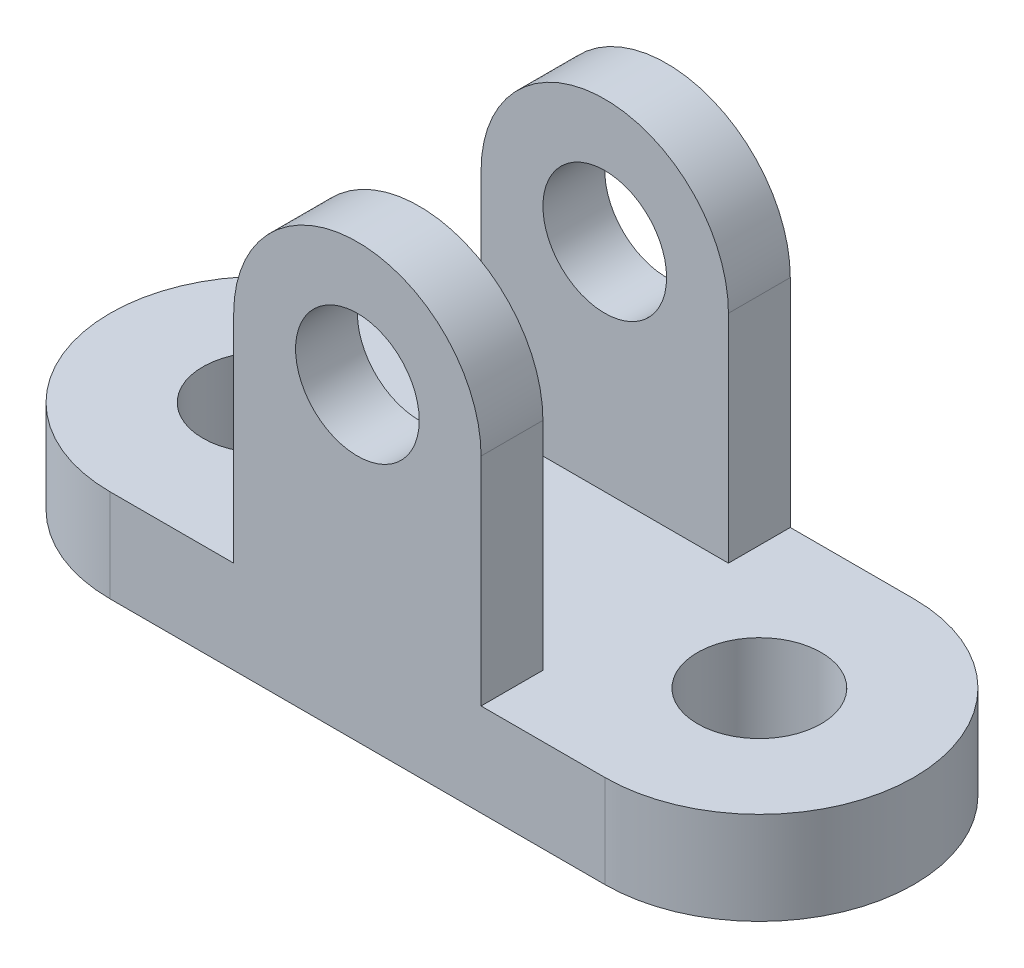
ISO-10303-21;
HEADER;
FILE_DESCRIPTION(('STEP AP214'),'2;1');
FILE_NAME('part.step','',(''),(''),'','','');
FILE_SCHEMA(('AUTOMOTIVE_DESIGN { 1 0 10303 214 1 1 1 1 }'));
ENDSEC;
DATA;
#1=APPLICATION_CONTEXT('core data for automotive mechanical design processes');
#2=APPLICATION_PROTOCOL_DEFINITION('international standard','automotive_design',2000,#1);
#3=PRODUCT_CONTEXT('',#1,'mechanical');
#4=PRODUCT('Part','Part','',(#3));
#5=PRODUCT_RELATED_PRODUCT_CATEGORY('part','',(#4));
#6=PRODUCT_DEFINITION_FORMATION('','',#4);
#7=PRODUCT_DEFINITION_CONTEXT('part definition',#1,'design');
#8=PRODUCT_DEFINITION('design','',#6,#7);
#9=PRODUCT_DEFINITION_SHAPE('','',#8);
#10=(LENGTH_UNIT() NAMED_UNIT(*) SI_UNIT(.MILLI.,.METRE.));
#11=(NAMED_UNIT(*) PLANE_ANGLE_UNIT() SI_UNIT($,.RADIAN.));
#12=(NAMED_UNIT(*) SI_UNIT($,.STERADIAN.) SOLID_ANGLE_UNIT());
#13=UNCERTAINTY_MEASURE_WITH_UNIT(LENGTH_MEASURE(1.E-05),#10,'distance_accuracy_value','');
#14=(GEOMETRIC_REPRESENTATION_CONTEXT(3) GLOBAL_UNCERTAINTY_ASSIGNED_CONTEXT((#13)) GLOBAL_UNIT_ASSIGNED_CONTEXT((#10,
#11,#12)) REPRESENTATION_CONTEXT('',''));
#15=CARTESIAN_POINT('',(0.,0.,0.));
#16=DIRECTION('',(0.,0.,1.));
#17=DIRECTION('',(1.,0.,0.));
#18=AXIS2_PLACEMENT_3D('',#15,#16,#17);
#19=CARTESIAN_POINT('',(0.,50.,-25.));
#20=DIRECTION('',(0.,0.,-1.));
#21=DIRECTION('',(-1.,0.,0.));
#22=AXIS2_PLACEMENT_3D('',#19,#20,#21);
#23=CYLINDRICAL_SURFACE('',#22,20.);
#24=CARTESIAN_POINT('',(0.,50.,15.));
#25=DIRECTION('',(0.,0.,-1.));
#26=DIRECTION('',(-1.,0.,0.));
#27=AXIS2_PLACEMENT_3D('',#24,#25,#26);
#28=CIRCLE('',#27,20.);
#29=CARTESIAN_POINT('',(20.,50.,15.));
#30=VERTEX_POINT('',#29);
#31=CARTESIAN_POINT('',(-20.,50.,15.));
#32=VERTEX_POINT('',#31);
#33=EDGE_CURVE('E136',#30,#32,#28,.F.);
#34=ORIENTED_EDGE('',*,*,#33,.T.);
#35=DIRECTION('',(0.,0.,-1.));
#36=VECTOR('',#35,1.);
#37=CARTESIAN_POINT('',(-20.,50.,25.));
#38=LINE('',#37,#36);
#39=CARTESIAN_POINT('',(-20.,50.,25.));
#40=VERTEX_POINT('',#39);
#41=EDGE_CURVE('E198',#40,#32,#38,.T.);
#42=ORIENTED_EDGE('',*,*,#41,.F.);
#43=CARTESIAN_POINT('',(0.,50.,25.));
#44=DIRECTION('',(0.,0.,-1.));
#45=DIRECTION('',(-1.,0.,0.));
#46=AXIS2_PLACEMENT_3D('',#43,#44,#45);
#47=CIRCLE('',#46,20.);
#48=CARTESIAN_POINT('',(20.,50.,25.));
#49=VERTEX_POINT('',#48);
#50=EDGE_CURVE('E62',#49,#40,#47,.F.);
#51=ORIENTED_EDGE('',*,*,#50,.F.);
#52=DIRECTION('',(0.,0.,-1.));
#53=VECTOR('',#52,1.);
#54=CARTESIAN_POINT('',(20.,50.,25.));
#55=LINE('',#54,#53);
#56=EDGE_CURVE('E191',#30,#49,#55,.F.);
#57=ORIENTED_EDGE('',*,*,#56,.F.);
#58=EDGE_LOOP('',(#34,#42,#51,#57));
#59=FACE_BOUND('',#58,.T.);
#60=ADVANCED_FACE('F41',(#59),#23,.T.);
#61=CARTESIAN_POINT('',(0.,50.,-15.));
#62=DIRECTION('',(0.,0.,1.));
#63=DIRECTION('',(1.,0.,0.));
#64=AXIS2_PLACEMENT_3D('',#61,#62,#63);
#65=CIRCLE('',#64,20.);
#66=CARTESIAN_POINT('',(-20.,50.,-15.));
#67=VERTEX_POINT('',#66);
#68=CARTESIAN_POINT('',(20.,50.,-15.));
#69=VERTEX_POINT('',#68);
#70=EDGE_CURVE('E131',#67,#69,#65,.F.);
#71=ORIENTED_EDGE('',*,*,#70,.T.);
#72=CARTESIAN_POINT('',(20.,50.,-25.));
#73=VERTEX_POINT('',#72);
#74=EDGE_CURVE('E195',#73,#69,#55,.F.);
#75=ORIENTED_EDGE('',*,*,#74,.F.);
#76=CARTESIAN_POINT('',(0.,50.,-25.));
#77=DIRECTION('',(0.,0.,1.));
#78=DIRECTION('',(1.,0.,0.));
#79=AXIS2_PLACEMENT_3D('',#76,#77,#78);
#80=CIRCLE('',#79,20.);
#81=CARTESIAN_POINT('',(-20.,50.,-25.));
#82=VERTEX_POINT('',#81);
#83=EDGE_CURVE('E200',#82,#73,#80,.F.);
#84=ORIENTED_EDGE('',*,*,#83,.F.);
#85=EDGE_CURVE('E194',#67,#82,#38,.T.);
#86=ORIENTED_EDGE('',*,*,#85,.F.);
#87=EDGE_LOOP('',(#71,#75,#84,#86));
#88=FACE_BOUND('',#87,.T.);
#89=ADVANCED_FACE('F209',(#88),#23,.T.);
#90=CARTESIAN_POINT('',(-20.,70.,25.));
#91=DIRECTION('',(1.,0.,0.));
#92=DIRECTION('',(0.,1.,0.));
#93=AXIS2_PLACEMENT_3D('',#90,#91,#92);
#94=PLANE('',#93);
#95=DIRECTION('',(0.,1.,0.));
#96=VECTOR('',#95,1.);
#97=CARTESIAN_POINT('',(-20.,70.,15.));
#98=LINE('',#97,#96);
#99=CARTESIAN_POINT('',(-20.,15.,15.));
#100=VERTEX_POINT('',#99);
#101=EDGE_CURVE('E214',#100,#32,#98,.T.);
#102=ORIENTED_EDGE('',*,*,#101,.F.);
#103=DIRECTION('',(0.,0.,-1.));
#104=VECTOR('',#103,1.);
#105=CARTESIAN_POINT('',(-20.,15.,25.));
#106=LINE('',#105,#104);
#107=CARTESIAN_POINT('',(-20.,15.,25.));
#108=VERTEX_POINT('',#107);
#109=EDGE_CURVE('E151',#108,#100,#106,.T.);
#110=ORIENTED_EDGE('',*,*,#109,.F.);
#111=DIRECTION('',(0.,-1.,0.));
#112=VECTOR('',#111,1.);
#113=CARTESIAN_POINT('',(-20.,70.,25.));
#114=LINE('',#113,#112);
#115=EDGE_CURVE('E217',#40,#108,#114,.T.);
#116=ORIENTED_EDGE('',*,*,#115,.F.);
#117=ORIENTED_EDGE('',*,*,#41,.T.);
#118=EDGE_LOOP('',(#102,#110,#116,#117));
#119=FACE_BOUND('',#118,.T.);
#120=ADVANCED_FACE('F248',(#119),#94,.F.);
#121=DIRECTION('',(0.,-1.,0.));
#122=VECTOR('',#121,1.);
#123=CARTESIAN_POINT('',(-20.,70.,-15.));
#124=LINE('',#123,#122);
#125=CARTESIAN_POINT('',(-20.,15.,-15.));
#126=VERTEX_POINT('',#125);
#127=EDGE_CURVE('E128',#67,#126,#124,.T.);
#128=ORIENTED_EDGE('',*,*,#127,.F.);
#129=ORIENTED_EDGE('',*,*,#85,.T.);
#130=DIRECTION('',(0.,-1.,0.));
#131=VECTOR('',#130,1.);
#132=CARTESIAN_POINT('',(-20.,70.,-25.));
#133=LINE('',#132,#131);
#134=CARTESIAN_POINT('',(-20.,15.,-25.));
#135=VERTEX_POINT('',#134);
#136=EDGE_CURVE('E149',#82,#135,#133,.T.);
#137=ORIENTED_EDGE('',*,*,#136,.T.);
#138=EDGE_CURVE('E143',#126,#135,#106,.T.);
#139=ORIENTED_EDGE('',*,*,#138,.F.);
#140=EDGE_LOOP('',(#128,#129,#137,#139));
#141=FACE_BOUND('',#140,.T.);
#142=ADVANCED_FACE('F150',(#141),#94,.F.);
#143=CARTESIAN_POINT('',(20.,70.,25.));
#144=DIRECTION('',(-1.,0.,0.));
#145=DIRECTION('',(0.,-1.,0.));
#146=AXIS2_PLACEMENT_3D('',#143,#144,#145);
#147=PLANE('',#146);
#148=DIRECTION('',(0.,-1.,0.));
#149=VECTOR('',#148,1.);
#150=CARTESIAN_POINT('',(20.,70.,15.));
#151=LINE('',#150,#149);
#152=CARTESIAN_POINT('',(20.,15.,15.));
#153=VERTEX_POINT('',#152);
#154=EDGE_CURVE('E11',#30,#153,#151,.T.);
#155=ORIENTED_EDGE('',*,*,#154,.F.);
#156=ORIENTED_EDGE('',*,*,#56,.T.);
#157=DIRECTION('',(0.,1.,0.));
#158=VECTOR('',#157,1.);
#159=CARTESIAN_POINT('',(20.,70.,25.));
#160=LINE('',#159,#158);
#161=CARTESIAN_POINT('',(20.,15.,25.));
#162=VERTEX_POINT('',#161);
#163=EDGE_CURVE('E219',#162,#49,#160,.T.);
#164=ORIENTED_EDGE('',*,*,#163,.F.);
#165=DIRECTION('',(0.,0.,-1.));
#166=VECTOR('',#165,1.);
#167=CARTESIAN_POINT('',(20.,15.,25.));
#168=LINE('',#167,#166);
#169=EDGE_CURVE('E155',#162,#153,#168,.T.);
#170=ORIENTED_EDGE('',*,*,#169,.T.);
#171=EDGE_LOOP('',(#155,#156,#164,#170));
#172=FACE_BOUND('',#171,.T.);
#173=ADVANCED_FACE('F255',(#172),#147,.F.);
#174=DIRECTION('',(0.,1.,0.));
#175=VECTOR('',#174,1.);
#176=CARTESIAN_POINT('',(20.,70.,-15.));
#177=LINE('',#176,#175);
#178=CARTESIAN_POINT('',(20.,15.,-15.));
#179=VERTEX_POINT('',#178);
#180=EDGE_CURVE('E49',#179,#69,#177,.T.);
#181=ORIENTED_EDGE('',*,*,#180,.F.);
#182=CARTESIAN_POINT('',(20.,15.,-25.));
#183=VERTEX_POINT('',#182);
#184=EDGE_CURVE('E145',#179,#183,#168,.T.);
#185=ORIENTED_EDGE('',*,*,#184,.T.);
#186=DIRECTION('',(0.,1.,0.));
#187=VECTOR('',#186,1.);
#188=CARTESIAN_POINT('',(20.,70.,-25.));
#189=LINE('',#188,#187);
#190=EDGE_CURVE('E210',#183,#73,#189,.T.);
#191=ORIENTED_EDGE('',*,*,#190,.T.);
#192=ORIENTED_EDGE('',*,*,#74,.T.);
#193=EDGE_LOOP('',(#181,#185,#191,#192));
#194=FACE_BOUND('',#193,.T.);
#195=ADVANCED_FACE('F202',(#194),#147,.F.);
#196=CARTESIAN_POINT('',(-40.,15.,0.));
#197=DIRECTION('',(0.,-1.,0.));
#198=DIRECTION('',(0.,0.,-1.));
#199=AXIS2_PLACEMENT_3D('',#196,#197,#198);
#200=CYLINDRICAL_SURFACE('',#199,25.);
#201=CARTESIAN_POINT('',(-40.,0.,0.));
#202=DIRECTION('',(0.,1.,0.));
#203=DIRECTION('',(0.,0.,1.));
#204=AXIS2_PLACEMENT_3D('',#201,#202,#203);
#205=CIRCLE('',#204,25.);
#206=CARTESIAN_POINT('',(-40.,0.,-25.));
#207=VERTEX_POINT('',#206);
#208=CARTESIAN_POINT('',(-40.,0.,25.));
#209=VERTEX_POINT('',#208);
#210=EDGE_CURVE('E154',#207,#209,#205,.T.);
#211=ORIENTED_EDGE('',*,*,#210,.T.);
#212=DIRECTION('',(0.,-1.,0.));
#213=VECTOR('',#212,1.);
#214=CARTESIAN_POINT('',(-40.,15.,25.));
#215=LINE('',#214,#213);
#216=CARTESIAN_POINT('',(-40.,15.,25.));
#217=VERTEX_POINT('',#216);
#218=EDGE_CURVE('E190',#217,#209,#215,.T.);
#219=ORIENTED_EDGE('',*,*,#218,.F.);
#220=CARTESIAN_POINT('',(-40.,15.,0.));
#221=DIRECTION('',(0.,1.,0.));
#222=DIRECTION('',(0.,0.,1.));
#223=AXIS2_PLACEMENT_3D('',#220,#221,#222);
#224=CIRCLE('',#223,25.);
#225=CARTESIAN_POINT('',(-40.,15.,-25.));
#226=VERTEX_POINT('',#225);
#227=EDGE_CURVE('E159',#226,#217,#224,.T.);
#228=ORIENTED_EDGE('',*,*,#227,.F.);
#229=DIRECTION('',(0.,-1.,0.));
#230=VECTOR('',#229,1.);
#231=CARTESIAN_POINT('',(-40.,15.,-25.));
#232=LINE('',#231,#230);
#233=EDGE_CURVE('E171',#226,#207,#232,.T.);
#234=ORIENTED_EDGE('',*,*,#233,.T.);
#235=EDGE_LOOP('',(#211,#219,#228,#234));
#236=FACE_BOUND('',#235,.T.);
#237=ADVANCED_FACE('F238',(#236),#200,.T.);
#238=CARTESIAN_POINT('',(-40.,15.,25.));
#239=DIRECTION('',(0.,0.,-1.));
#240=DIRECTION('',(-1.,0.,0.));
#241=AXIS2_PLACEMENT_3D('',#238,#239,#240);
#242=PLANE('',#241);
#243=CARTESIAN_POINT('',(0.,50.,25.));
#244=DIRECTION('',(0.,0.,1.));
#245=DIRECTION('',(1.,0.,0.));
#246=AXIS2_PLACEMENT_3D('',#243,#244,#245);
#247=CIRCLE('',#246,9.99999999999999);
#248=CARTESIAN_POINT('',(9.99999999999998,50.,25.));
#249=VERTEX_POINT('',#248);
#250=EDGE_CURVE('E370',#249,#249,#247,.T.);
#251=ORIENTED_EDGE('',*,*,#250,.F.);
#252=EDGE_LOOP('',(#251));
#253=FACE_BOUND('',#252,.T.);
#254=ORIENTED_EDGE('',*,*,#163,.T.);
#255=ORIENTED_EDGE('',*,*,#50,.T.);
#256=ORIENTED_EDGE('',*,*,#115,.T.);
#257=DIRECTION('',(1.,0.,0.));
#258=VECTOR('',#257,1.);
#259=CARTESIAN_POINT('',(-40.,15.,25.));
#260=LINE('',#259,#258);
#261=EDGE_CURVE('E163',#217,#108,#260,.T.);
#262=ORIENTED_EDGE('',*,*,#261,.F.);
#263=ORIENTED_EDGE('',*,*,#218,.T.);
#264=DIRECTION('',(1.,0.,0.));
#265=VECTOR('',#264,1.);
#266=CARTESIAN_POINT('',(-40.,0.,25.));
#267=LINE('',#266,#265);
#268=CARTESIAN_POINT('',(40.,0.,25.));
#269=VERTEX_POINT('',#268);
#270=EDGE_CURVE('E172',#209,#269,#267,.T.);
#271=ORIENTED_EDGE('',*,*,#270,.T.);
#272=DIRECTION('',(0.,-1.,0.));
#273=VECTOR('',#272,1.);
#274=CARTESIAN_POINT('',(40.,15.,25.));
#275=LINE('',#274,#273);
#276=CARTESIAN_POINT('',(40.,15.,25.));
#277=VERTEX_POINT('',#276);
#278=EDGE_CURVE('E183',#277,#269,#275,.T.);
#279=ORIENTED_EDGE('',*,*,#278,.F.);
#280=EDGE_CURVE('E165',#162,#277,#260,.T.);
#281=ORIENTED_EDGE('',*,*,#280,.F.);
#282=EDGE_LOOP('',(#254,#255,#256,#262,#263,#271,#279,#281));
#283=FACE_BOUND('',#282,.T.);
#284=ADVANCED_FACE('F245',(#253,#283),#242,.F.);
#285=CARTESIAN_POINT('',(40.,15.,0.));
#286=DIRECTION('',(0.,-1.,0.));
#287=DIRECTION('',(0.,0.,-1.));
#288=AXIS2_PLACEMENT_3D('',#285,#286,#287);
#289=CYLINDRICAL_SURFACE('',#288,25.);
#290=CARTESIAN_POINT('',(40.,0.,0.));
#291=DIRECTION('',(0.,1.,0.));
#292=DIRECTION('',(0.,0.,1.));
#293=AXIS2_PLACEMENT_3D('',#290,#291,#292);
#294=CIRCLE('',#293,25.);
#295=CARTESIAN_POINT('',(40.,0.,-25.));
#296=VERTEX_POINT('',#295);
#297=EDGE_CURVE('E180',#269,#296,#294,.T.);
#298=ORIENTED_EDGE('',*,*,#297,.T.);
#299=DIRECTION('',(0.,-1.,0.));
#300=VECTOR('',#299,1.);
#301=CARTESIAN_POINT('',(40.,15.,-25.));
#302=LINE('',#301,#300);
#303=CARTESIAN_POINT('',(40.,15.,-25.));
#304=VERTEX_POINT('',#303);
#305=EDGE_CURVE('E185',#304,#296,#302,.T.);
#306=ORIENTED_EDGE('',*,*,#305,.F.);
#307=CARTESIAN_POINT('',(40.,15.,0.));
#308=DIRECTION('',(0.,1.,0.));
#309=DIRECTION('',(0.,0.,1.));
#310=AXIS2_PLACEMENT_3D('',#307,#308,#309);
#311=CIRCLE('',#310,25.);
#312=EDGE_CURVE('E170',#277,#304,#311,.T.);
#313=ORIENTED_EDGE('',*,*,#312,.F.);
#314=ORIENTED_EDGE('',*,*,#278,.T.);
#315=EDGE_LOOP('',(#298,#306,#313,#314));
#316=FACE_BOUND('',#315,.T.);
#317=ADVANCED_FACE('F231',(#316),#289,.T.);
#318=CARTESIAN_POINT('',(-40.,15.,-25.));
#319=DIRECTION('',(0.,0.,1.));
#320=DIRECTION('',(1.,0.,0.));
#321=AXIS2_PLACEMENT_3D('',#318,#319,#320);
#322=PLANE('',#321);
#323=CARTESIAN_POINT('',(0.,50.,-25.));
#324=DIRECTION('',(0.,0.,1.));
#325=DIRECTION('',(1.,0.,0.));
#326=AXIS2_PLACEMENT_3D('',#323,#324,#325);
#327=CIRCLE('',#326,9.99999999999999);
#328=CARTESIAN_POINT('',(9.99999999999999,50.,-25.));
#329=VERTEX_POINT('',#328);
#330=EDGE_CURVE('E366',#329,#329,#327,.T.);
#331=ORIENTED_EDGE('',*,*,#330,.T.);
#332=EDGE_LOOP('',(#331));
#333=FACE_BOUND('',#332,.T.);
#334=ORIENTED_EDGE('',*,*,#136,.F.);
#335=ORIENTED_EDGE('',*,*,#83,.T.);
#336=ORIENTED_EDGE('',*,*,#190,.F.);
#337=DIRECTION('',(-1.,0.,0.));
#338=VECTOR('',#337,1.);
#339=CARTESIAN_POINT('',(-40.,15.,-25.));
#340=LINE('',#339,#338);
#341=EDGE_CURVE('E168',#304,#183,#340,.T.);
#342=ORIENTED_EDGE('',*,*,#341,.F.);
#343=ORIENTED_EDGE('',*,*,#305,.T.);
#344=DIRECTION('',(-1.,0.,0.));
#345=VECTOR('',#344,1.);
#346=CARTESIAN_POINT('',(-40.,0.,-25.));
#347=LINE('',#346,#345);
#348=EDGE_CURVE('E162',#296,#207,#347,.T.);
#349=ORIENTED_EDGE('',*,*,#348,.T.);
#350=ORIENTED_EDGE('',*,*,#233,.F.);
#351=EDGE_CURVE('E166',#135,#226,#340,.T.);
#352=ORIENTED_EDGE('',*,*,#351,.F.);
#353=EDGE_LOOP('',(#334,#335,#336,#342,#343,#349,#350,#352));
#354=FACE_BOUND('',#353,.T.);
#355=ADVANCED_FACE('F223',(#333,#354),#322,.F.);
#356=CARTESIAN_POINT('',(-40.,15.,0.));
#357=DIRECTION('',(0.,1.,0.));
#358=DIRECTION('',(0.,0.,1.));
#359=AXIS2_PLACEMENT_3D('',#356,#357,#358);
#360=PLANE('',#359);
#361=CARTESIAN_POINT('',(40.,15.,0.));
#362=DIRECTION('',(0.,1.,0.));
#363=DIRECTION('',(0.,0.,1.));
#364=AXIS2_PLACEMENT_3D('',#361,#362,#363);
#365=CIRCLE('',#364,9.99999999999999);
#366=CARTESIAN_POINT('',(40.,15.,9.99999999999998));
#367=VERTEX_POINT('',#366);
#368=EDGE_CURVE('E372',#367,#367,#365,.T.);
#369=ORIENTED_EDGE('',*,*,#368,.F.);
#370=EDGE_LOOP('',(#369));
#371=FACE_BOUND('',#370,.T.);
#372=CARTESIAN_POINT('',(-40.,15.,0.));
#373=DIRECTION('',(0.,1.,0.));
#374=DIRECTION('',(0.,0.,1.));
#375=AXIS2_PLACEMENT_3D('',#372,#373,#374);
#376=CIRCLE('',#375,10.);
#377=CARTESIAN_POINT('',(-40.,15.,10.));
#378=VERTEX_POINT('',#377);
#379=EDGE_CURVE('E379',#378,#378,#376,.T.);
#380=ORIENTED_EDGE('',*,*,#379,.F.);
#381=EDGE_LOOP('',(#380));
#382=FACE_BOUND('',#381,.T.);
#383=ORIENTED_EDGE('',*,*,#312,.T.);
#384=ORIENTED_EDGE('',*,*,#341,.T.);
#385=ORIENTED_EDGE('',*,*,#184,.F.);
#386=DIRECTION('',(-1.,0.,0.));
#387=VECTOR('',#386,1.);
#388=CARTESIAN_POINT('',(-60.1608300907912,15.,-15.));
#389=LINE('',#388,#387);
#390=EDGE_CURVE('E60',#179,#126,#389,.T.);
#391=ORIENTED_EDGE('',*,*,#390,.T.);
#392=ORIENTED_EDGE('',*,*,#138,.T.);
#393=ORIENTED_EDGE('',*,*,#351,.T.);
#394=ORIENTED_EDGE('',*,*,#227,.T.);
#395=ORIENTED_EDGE('',*,*,#261,.T.);
#396=ORIENTED_EDGE('',*,*,#109,.T.);
#397=DIRECTION('',(1.,0.,0.));
#398=VECTOR('',#397,1.);
#399=CARTESIAN_POINT('',(-60.1608300907912,15.,15.));
#400=LINE('',#399,#398);
#401=EDGE_CURVE('E144',#100,#153,#400,.T.);
#402=ORIENTED_EDGE('',*,*,#401,.T.);
#403=ORIENTED_EDGE('',*,*,#169,.F.);
#404=ORIENTED_EDGE('',*,*,#280,.T.);
#405=EDGE_LOOP('',(#383,#384,#385,#391,#392,#393,#394,#395,#396,#402,#403,#404));
#406=FACE_BOUND('',#405,.T.);
#407=ADVANCED_FACE('F139',(#371,#382,#406),#360,.T.);
#408=CARTESIAN_POINT('',(-40.,0.,0.));
#409=DIRECTION('',(0.,1.,0.));
#410=DIRECTION('',(0.,0.,1.));
#411=AXIS2_PLACEMENT_3D('',#408,#409,#410);
#412=PLANE('',#411);
#413=CARTESIAN_POINT('',(40.,0.,0.));
#414=DIRECTION('',(0.,1.,0.));
#415=DIRECTION('',(0.,0.,1.));
#416=AXIS2_PLACEMENT_3D('',#413,#414,#415);
#417=CIRCLE('',#416,9.99999999999999);
#418=CARTESIAN_POINT('',(40.,0.,9.99999999999998));
#419=VERTEX_POINT('',#418);
#420=EDGE_CURVE('E380',#419,#419,#417,.T.);
#421=ORIENTED_EDGE('',*,*,#420,.T.);
#422=EDGE_LOOP('',(#421));
#423=FACE_BOUND('',#422,.T.);
#424=CARTESIAN_POINT('',(-40.,0.,0.));
#425=DIRECTION('',(0.,1.,0.));
#426=DIRECTION('',(0.,0.,1.));
#427=AXIS2_PLACEMENT_3D('',#424,#425,#426);
#428=CIRCLE('',#427,9.99999999999999);
#429=CARTESIAN_POINT('',(-40.,0.,9.99999999999999));
#430=VERTEX_POINT('',#429);
#431=EDGE_CURVE('E253',#430,#430,#428,.T.);
#432=ORIENTED_EDGE('',*,*,#431,.T.);
#433=EDGE_LOOP('',(#432));
#434=FACE_BOUND('',#433,.T.);
#435=ORIENTED_EDGE('',*,*,#210,.F.);
#436=ORIENTED_EDGE('',*,*,#348,.F.);
#437=ORIENTED_EDGE('',*,*,#297,.F.);
#438=ORIENTED_EDGE('',*,*,#270,.F.);
#439=EDGE_LOOP('',(#435,#436,#437,#438));
#440=FACE_BOUND('',#439,.T.);
#441=ADVANCED_FACE('F240',(#423,#434,#440),#412,.F.);
#442=CARTESIAN_POINT('',(-60.1608300907912,70.,15.));
#443=DIRECTION('',(0.,0.,-1.));
#444=DIRECTION('',(-1.,0.,0.));
#445=AXIS2_PLACEMENT_3D('',#442,#443,#444);
#446=PLANE('',#445);
#447=CARTESIAN_POINT('',(0.,50.,15.));
#448=DIRECTION('',(0.,0.,-1.));
#449=DIRECTION('',(-1.,0.,0.));
#450=AXIS2_PLACEMENT_3D('',#447,#448,#449);
#451=CIRCLE('',#450,9.99999999999999);
#452=CARTESIAN_POINT('',(-10.,50.,15.));
#453=VERTEX_POINT('',#452);
#454=EDGE_CURVE('E365',#453,#453,#451,.T.);
#455=ORIENTED_EDGE('',*,*,#454,.F.);
#456=EDGE_LOOP('',(#455));
#457=FACE_BOUND('',#456,.T.);
#458=ORIENTED_EDGE('',*,*,#101,.T.);
#459=ORIENTED_EDGE('',*,*,#33,.F.);
#460=ORIENTED_EDGE('',*,*,#154,.T.);
#461=ORIENTED_EDGE('',*,*,#401,.F.);
#462=EDGE_LOOP('',(#458,#459,#460,#461));
#463=FACE_BOUND('',#462,.T.);
#464=ADVANCED_FACE('F260',(#457,#463),#446,.T.);
#465=CARTESIAN_POINT('',(-60.1608300907912,70.,-15.));
#466=DIRECTION('',(0.,0.,1.));
#467=DIRECTION('',(1.,0.,0.));
#468=AXIS2_PLACEMENT_3D('',#465,#466,#467);
#469=PLANE('',#468);
#470=CARTESIAN_POINT('',(0.,50.,-15.));
#471=DIRECTION('',(0.,0.,1.));
#472=DIRECTION('',(1.,0.,0.));
#473=AXIS2_PLACEMENT_3D('',#470,#471,#472);
#474=CIRCLE('',#473,9.99999999999999);
#475=CARTESIAN_POINT('',(9.99999999999999,50.,-15.));
#476=VERTEX_POINT('',#475);
#477=EDGE_CURVE('E44',#476,#476,#474,.T.);
#478=ORIENTED_EDGE('',*,*,#477,.F.);
#479=EDGE_LOOP('',(#478));
#480=FACE_BOUND('',#479,.T.);
#481=ORIENTED_EDGE('',*,*,#127,.T.);
#482=ORIENTED_EDGE('',*,*,#390,.F.);
#483=ORIENTED_EDGE('',*,*,#180,.T.);
#484=ORIENTED_EDGE('',*,*,#70,.F.);
#485=EDGE_LOOP('',(#481,#482,#483,#484));
#486=FACE_BOUND('',#485,.T.);
#487=ADVANCED_FACE('F134',(#480,#486),#469,.T.);
#488=CARTESIAN_POINT('',(-40.,15.,0.));
#489=DIRECTION('',(0.,1.,0.));
#490=DIRECTION('',(0.,0.,1.));
#491=AXIS2_PLACEMENT_3D('',#488,#489,#490);
#492=CYLINDRICAL_SURFACE('',#491,10.);
#493=ORIENTED_EDGE('',*,*,#431,.F.);
#494=EDGE_LOOP('',(#493));
#495=FACE_BOUND('',#494,.T.);
#496=ORIENTED_EDGE('',*,*,#379,.T.);
#497=EDGE_LOOP('',(#496));
#498=FACE_BOUND('',#497,.T.);
#499=ADVANCED_FACE('F264',(#495,#498),#492,.F.);
#500=CARTESIAN_POINT('',(40.,15.,0.));
#501=DIRECTION('',(0.,1.,0.));
#502=DIRECTION('',(0.,0.,1.));
#503=AXIS2_PLACEMENT_3D('',#500,#501,#502);
#504=CYLINDRICAL_SURFACE('',#503,9.99999999999999);
#505=ORIENTED_EDGE('',*,*,#420,.F.);
#506=EDGE_LOOP('',(#505));
#507=FACE_BOUND('',#506,.T.);
#508=ORIENTED_EDGE('',*,*,#368,.T.);
#509=EDGE_LOOP('',(#508));
#510=FACE_BOUND('',#509,.T.);
#511=ADVANCED_FACE('F329',(#507,#510),#504,.F.);
#512=CARTESIAN_POINT('',(0.,50.,25.));
#513=DIRECTION('',(0.,0.,1.));
#514=DIRECTION('',(1.,0.,0.));
#515=AXIS2_PLACEMENT_3D('',#512,#513,#514);
#516=CYLINDRICAL_SURFACE('',#515,9.99999999999999);
#517=ORIENTED_EDGE('',*,*,#477,.T.);
#518=EDGE_LOOP('',(#517));
#519=FACE_BOUND('',#518,.T.);
#520=ORIENTED_EDGE('',*,*,#330,.F.);
#521=EDGE_LOOP('',(#520));
#522=FACE_BOUND('',#521,.T.);
#523=ADVANCED_FACE('F338',(#519,#522),#516,.F.);
#524=ORIENTED_EDGE('',*,*,#454,.T.);
#525=EDGE_LOOP('',(#524));
#526=FACE_BOUND('',#525,.T.);
#527=ORIENTED_EDGE('',*,*,#250,.T.);
#528=EDGE_LOOP('',(#527));
#529=FACE_BOUND('',#528,.T.);
#530=ADVANCED_FACE('F346',(#526,#529),#516,.F.);
#531=CLOSED_SHELL('',(#60,#89,#120,#142,#173,#195,#237,#284,#317,#355,#407,#441,#464,#487,#499,
#511,#523,#530));
#532=MANIFOLD_SOLID_BREP('B2',#531);
#533=ADVANCED_BREP_SHAPE_REPRESENTATION('',(#18,#532),#14);
#534=SHAPE_DEFINITION_REPRESENTATION(#9,#533);
ENDSEC;
END-ISO-10303-21;
